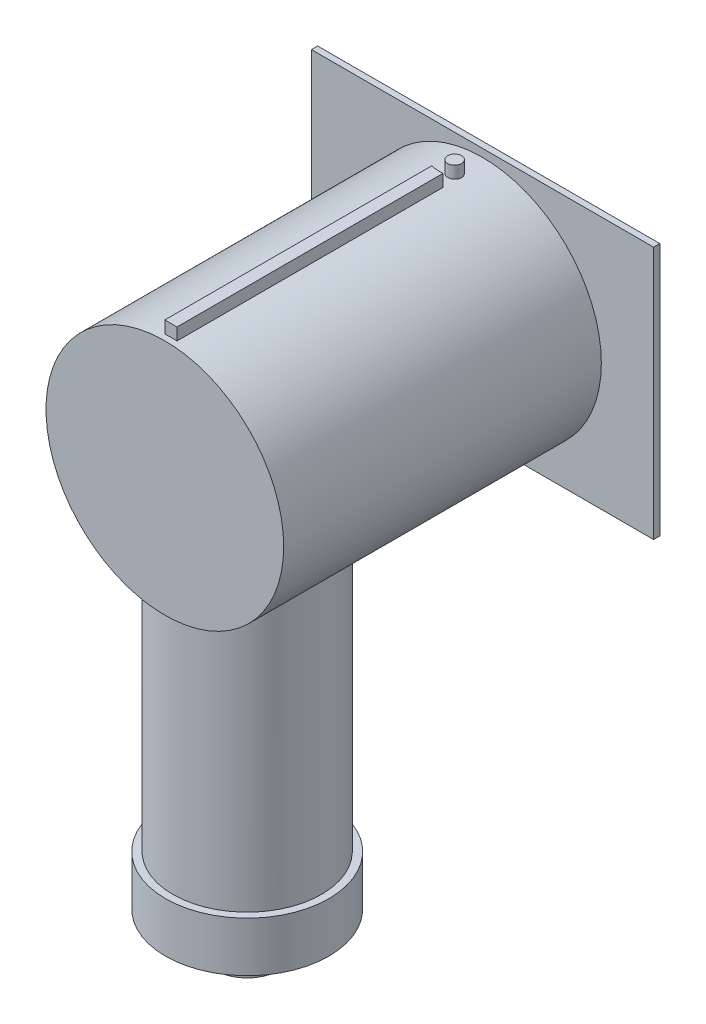
ISO-10303-21;
HEADER;
FILE_DESCRIPTION(('STEP AP214'),'2;1');
FILE_NAME('part.step','',(''),(''),'','','');
FILE_SCHEMA(('AUTOMOTIVE_DESIGN { 1 0 10303 214 1 1 1 1 }'));
ENDSEC;
DATA;
#1=APPLICATION_CONTEXT('core data for automotive mechanical design processes');
#2=APPLICATION_PROTOCOL_DEFINITION('international standard','automotive_design',2000,#1);
#3=PRODUCT_CONTEXT('',#1,'mechanical');
#4=PRODUCT('Part','Part','',(#3));
#5=PRODUCT_RELATED_PRODUCT_CATEGORY('part','',(#4));
#6=PRODUCT_DEFINITION_FORMATION('','',#4);
#7=PRODUCT_DEFINITION_CONTEXT('part definition',#1,'design');
#8=PRODUCT_DEFINITION('design','',#6,#7);
#9=PRODUCT_DEFINITION_SHAPE('','',#8);
#10=(LENGTH_UNIT() NAMED_UNIT(*) SI_UNIT(.MILLI.,.METRE.));
#11=(NAMED_UNIT(*) PLANE_ANGLE_UNIT() SI_UNIT($,.RADIAN.));
#12=(NAMED_UNIT(*) SI_UNIT($,.STERADIAN.) SOLID_ANGLE_UNIT());
#13=UNCERTAINTY_MEASURE_WITH_UNIT(LENGTH_MEASURE(1.E-05),#10,'distance_accuracy_value','');
#14=(GEOMETRIC_REPRESENTATION_CONTEXT(3) GLOBAL_UNCERTAINTY_ASSIGNED_CONTEXT((#13)) GLOBAL_UNIT_ASSIGNED_CONTEXT((#10,
#11,#12)) REPRESENTATION_CONTEXT('',''));
#15=CARTESIAN_POINT('',(0.,0.,0.));
#16=DIRECTION('',(0.,0.,1.));
#17=DIRECTION('',(1.,0.,0.));
#18=AXIS2_PLACEMENT_3D('',#15,#16,#17);
#19=CARTESIAN_POINT('',(0.,0.,6.5));
#20=DIRECTION('',(0.,0.,-1.));
#21=DIRECTION('',(-1.,0.,0.));
#22=AXIS2_PLACEMENT_3D('',#19,#20,#21);
#23=CYLINDRICAL_SURFACE('',#22,2.3845167259063);
#24=DIRECTION('',(0.,0.,-1.));
#25=VECTOR('',#24,1.);
#26=CARTESIAN_POINT('',(-0.122121934554715,2.38138746306171,6.5));
#27=LINE('',#26,#25);
#28=CARTESIAN_POINT('',(-0.122121934554715,2.38138746306171,1.01892619563497));
#29=VERTEX_POINT('',#28);
#30=CARTESIAN_POINT('',(-0.122121934554715,2.38138746306171,6.37896582971287));
#31=VERTEX_POINT('',#30);
#32=EDGE_CURVE('E169',#29,#31,#27,.F.);
#33=ORIENTED_EDGE('',*,*,#32,.F.);
#34=CARTESIAN_POINT('',(-0.122121934554715,2.38138746306171,1.01892619563497));
#35=CARTESIAN_POINT('',(-0.102085989813972,2.38241763743722,1.02432102156372));
#36=CARTESIAN_POINT('',(-0.0817986557812083,2.38320180110364,1.02884606236923));
#37=CARTESIAN_POINT('',(-0.0408908355822062,2.38425321733201,1.03609583819693));
#38=CARTESIAN_POINT('',(-0.0202703282168622,2.38452043687028,1.0388204581964));
#39=CARTESIAN_POINT('',(0.0206588553751885,2.38451302280561,1.04236698778209));
#40=CARTESIAN_POINT('',(0.04096389854405,2.38425062427631,1.04323092905572));
#41=CARTESIAN_POINT('',(0.0815835692787753,2.38320804786599,1.04321060789996));
#42=CARTESIAN_POINT('',(0.101898181072966,2.38242727571816,1.04232433671077));
#43=CARTESIAN_POINT('',(0.122121934554715,2.38138746306171,1.04057675696859));
#44=B_SPLINE_CURVE_WITH_KNOTS('',3,(#34,#35,#36,#37,#38,#39,#40,#41,#42,#43),.UNSPECIFIED.,.F.,
.F.,(4,2,2,2,4),(0.,0.0623114777401351,0.124626935962479,0.185519280055164,0.246481552334192),.UNSPECIFIED.);
#45=CARTESIAN_POINT('',(0.122121934554715,2.38138746306171,1.04057675696859));
#46=VERTEX_POINT('',#45);
#47=EDGE_CURVE('E54',#29,#46,#44,.T.);
#48=ORIENTED_EDGE('',*,*,#47,.T.);
#49=DIRECTION('',(0.,0.,-1.));
#50=VECTOR('',#49,1.);
#51=CARTESIAN_POINT('',(0.122121934554715,2.38138746306171,6.5));
#52=LINE('',#51,#50);
#53=CARTESIAN_POINT('',(0.122121934554715,2.38138746306171,6.37896582971287));
#54=VERTEX_POINT('',#53);
#55=EDGE_CURVE('E194',#46,#54,#52,.F.);
#56=ORIENTED_EDGE('',*,*,#55,.T.);
#57=CARTESIAN_POINT('',(0.,0.,6.37896582971287));
#58=DIRECTION('',(0.,0.,1.));
#59=DIRECTION('',(1.,0.,0.));
#60=AXIS2_PLACEMENT_3D('',#57,#58,#59);
#61=CIRCLE('',#60,2.3845167259063);
#62=EDGE_CURVE('E225',#54,#31,#61,.T.);
#63=ORIENTED_EDGE('',*,*,#62,.T.);
#64=EDGE_LOOP('',(#33,#48,#56,#63));
#65=FACE_BOUND('',#64,.T.);
#66=CARTESIAN_POINT('',(0.,0.,6.5));
#67=DIRECTION('',(0.,0.,1.));
#68=DIRECTION('',(1.,0.,0.));
#69=AXIS2_PLACEMENT_3D('',#66,#67,#68);
#70=CIRCLE('',#69,2.3845167259063);
#71=CARTESIAN_POINT('',(2.3845167259063,0.,6.5));
#72=VERTEX_POINT('',#71);
#73=EDGE_CURVE('E237',#72,#72,#70,.T.);
#74=ORIENTED_EDGE('',*,*,#73,.F.);
#75=EDGE_LOOP('',(#74));
#76=FACE_BOUND('',#75,.T.);
#77=CARTESIAN_POINT('',(0.,0.,0.125));
#78=DIRECTION('',(0.,0.,1.));
#79=DIRECTION('',(1.,0.,0.));
#80=AXIS2_PLACEMENT_3D('',#77,#78,#79);
#81=CIRCLE('',#80,2.3845167259063);
#82=CARTESIAN_POINT('',(2.3845167259063,0.,0.125));
#83=VERTEX_POINT('',#82);
#84=EDGE_CURVE('E191',#83,#83,#81,.T.);
#85=ORIENTED_EDGE('',*,*,#84,.T.);
#86=EDGE_LOOP('',(#85));
#87=FACE_BOUND('',#86,.T.);
#88=CARTESIAN_POINT('',(0.212826258076589,-2.375,3.32366384002746));
#89=CARTESIAN_POINT('',(0.142938540129505,-2.38126357883713,3.3108127370552));
#90=CARTESIAN_POINT('',(0.0718669584959559,-2.38449897489251,3.30292980364695));
#91=CARTESIAN_POINT('',(-0.0706808363945598,-2.38453432941735,3.29742804666196));
#92=CARTESIAN_POINT('',(-0.142157070307155,-2.3813339563625,3.29980975185246));
#93=CARTESIAN_POINT('',(-0.29173310890456,-2.36792771622794,3.31552862510206));
#94=CARTESIAN_POINT('',(-0.369633798479355,-2.35694872881265,3.33011047157984));
#95=CARTESIAN_POINT('',(-0.520996468308414,-2.3281828403061,3.37091415405692));
#96=CARTESIAN_POINT('',(-0.594455008004497,-2.31039073854542,3.39714488447334));
#97=CARTESIAN_POINT('',(-0.734754746865814,-2.26966183942903,3.45974506340821));
#98=CARTESIAN_POINT('',(-0.801632525621713,-2.2467561030199,3.49605360888655));
#99=CARTESIAN_POINT('',(-0.928241927778966,-2.19747773935296,3.57762797738249));
#100=CARTESIAN_POINT('',(-0.987970793997837,-2.1711037826544,3.62289723860735));
#101=CARTESIAN_POINT('',(-1.1057056341888,-2.11378177979883,3.72675447497885));
#102=CARTESIAN_POINT('',(-1.16281477613432,-2.08264845892151,3.78625620491107));
#103=CARTESIAN_POINT('',(-1.26668511685379,-2.02115591434425,3.91410488453446));
#104=CARTESIAN_POINT('',(-1.31344321477456,-1.99079692501346,3.98245447507999));
#105=CARTESIAN_POINT('',(-1.39050655401137,-1.93760893295867,4.11832175300606));
#106=CARTESIAN_POINT('',(-1.42212862836919,-1.91431303671533,4.18490597390821));
#107=CARTESIAN_POINT('',(-1.47555243578993,-1.87344678808757,4.32352704754425));
#108=CARTESIAN_POINT('',(-1.49737141860018,-1.85586639376502,4.39555405996258));
#109=CARTESIAN_POINT('',(-1.52755089724699,-1.83107457684479,4.53240893422933));
#110=CARTESIAN_POINT('',(-1.53744587876416,-1.8226984751376,4.59668211199222));
#111=CARTESIAN_POINT('',(-1.54872763653146,-1.81312510278807,4.72648459846253));
#112=CARTESIAN_POINT('',(-1.55012110064506,-1.81192218925191,4.7920128791002));
#113=CARTESIAN_POINT('',(-1.54431722377654,-1.81686983069717,4.92235509454555));
#114=CARTESIAN_POINT('',(-1.5371246278066,-1.82301632409522,4.98716940395297));
#115=CARTESIAN_POINT('',(-1.51461060160071,-1.84176090494204,5.11443087030132));
#116=CARTESIAN_POINT('',(-1.49927893238694,-1.85436711804145,5.17687493921446));
#117=CARTESIAN_POINT('',(-1.45580505990154,-1.8887870588679,5.31539393486605));
#118=CARTESIAN_POINT('',(-1.42526307794793,-1.91219804383863,5.39031320667404));
#119=CARTESIAN_POINT('',(-1.35342384637945,-1.96369914766551,5.53303154839159));
#120=CARTESIAN_POINT('',(-1.3121126112133,-1.99179533376141,5.60082119751833));
#121=CARTESIAN_POINT('',(-1.21904864052438,-2.05009822208556,5.72956917799522));
#122=CARTESIAN_POINT('',(-1.16714540035314,-2.08033069540126,5.79040671327927));
#123=CARTESIAN_POINT('',(-1.05400603181466,-2.13987858629751,5.90329129765955));
#124=CARTESIAN_POINT('',(-0.992764871304995,-2.16919349908252,5.95533357497605));
#125=CARTESIAN_POINT('',(-0.854145840434318,-2.22769942981627,6.05490232590052));
#126=CARTESIAN_POINT('',(-0.775722729788127,-2.25649039049784,6.10122573894695));
#127=CARTESIAN_POINT('',(-0.609934712264235,-2.3068016126893,6.1792983208587));
#128=CARTESIAN_POINT('',(-0.522600771359867,-2.32834600574492,6.21109599069618));
#129=CARTESIAN_POINT('',(-0.39653835981177,-2.35159894487115,6.24388561469618));
#130=CARTESIAN_POINT('',(-0.360277487164992,-2.35743246259105,6.2518886626363));
#131=CARTESIAN_POINT('',(-0.287034625119794,-2.36746617058872,6.265197972155));
#132=CARTESIAN_POINT('',(-0.250052570219086,-2.37166621177149,6.27050398757645));
#133=CARTESIAN_POINT('',(-0.142249967498407,-2.38132043286589,6.28182456577913));
#134=CARTESIAN_POINT('',(-0.0707957364349295,-2.38452726904377,6.28421536683819));
#135=CARTESIAN_POINT('',(0.0717746292865236,-2.38450608692443,6.27873386695721));
#136=CARTESIAN_POINT('',(0.142890151643126,-2.38126906652708,6.27084721367761));
#137=CARTESIAN_POINT('',(0.291883919485536,-2.36791327807447,6.24344670523125));
#138=CARTESIAN_POINT('',(0.369434446387407,-2.3569520100626,6.22255051067457));
#139=CARTESIAN_POINT('',(0.519140405782813,-2.32856981997102,6.16915671217843));
#140=CARTESIAN_POINT('',(0.591292727700522,-2.31114520748603,6.13665248074066));
#141=CARTESIAN_POINT('',(0.728185878805484,-2.27172031519383,6.06164050341451));
#142=CARTESIAN_POINT('',(0.792967097839708,-2.24974703721209,6.01919160365642));
#143=CARTESIAN_POINT('',(0.91464012887446,-2.20308999471252,5.92540603579568));
#144=CARTESIAN_POINT('',(0.971527626050002,-2.17840476090459,5.87406454107003));
#145=CARTESIAN_POINT('',(1.08214238525339,-2.12579729808576,5.75773851828276));
#146=CARTESIAN_POINT('',(1.13493097389745,-2.09780475020128,5.691891477224));
#147=CARTESIAN_POINT('',(1.22902316654179,-2.04410312964557,5.55158748711998));
#148=CARTESIAN_POINT('',(1.27033090569855,-2.01839323708728,5.4771336517746));
#149=CARTESIAN_POINT('',(1.33431089382563,-1.97654945849168,5.33381780137487));
#150=CARTESIAN_POINT('',(1.35894178612245,-1.95953370085548,5.26609263249386));
#151=CARTESIAN_POINT('',(1.39832206826948,-1.93163271582537,5.1266498971412));
#152=CARTESIAN_POINT('',(1.41308549643197,-1.92073878252302,5.05493816042664));
#153=CARTESIAN_POINT('',(1.43196495191351,-1.90671051516325,4.90890175633298));
#154=CARTESIAN_POINT('',(1.43601790519399,-1.90362215277295,4.83456421136378));
#155=CARTESIAN_POINT('',(1.43299270635499,-1.9058998874539,4.68623828572052));
#156=CARTESIAN_POINT('',(1.42591280737693,-1.9112673113249,4.61224996167));
#157=CARTESIAN_POINT('',(1.40222684703537,-1.92869497681388,4.47351747463281));
#158=CARTESIAN_POINT('',(1.38651607210959,-1.94012315552653,4.40853355051799));
#159=CARTESIAN_POINT('',(1.34698227272831,-1.96777485556509,4.28217525172459));
#160=CARTESIAN_POINT('',(1.32315595160279,-1.98400032527647,4.22080235580601));
#161=CARTESIAN_POINT('',(1.26465268118061,-2.02186318500433,4.0950330869427));
#162=CARTESIAN_POINT('',(1.22898828288742,-2.04392448099772,4.03122636583707));
#163=CARTESIAN_POINT('',(1.14911999803909,-2.08987293523622,3.90989476946634));
#164=CARTESIAN_POINT('',(1.10490834524453,-2.11376174198077,3.85237568227239));
#165=CARTESIAN_POINT('',(0.999783125442746,-2.16572988113784,3.73441708419353));
#166=CARTESIAN_POINT('',(0.937294103150628,-2.19377928149274,3.67535657377612));
#167=CARTESIAN_POINT('',(0.802250437963933,-2.24667844978581,3.5683116019412));
#168=CARTESIAN_POINT('',(0.729699536436778,-2.27152940043052,3.52032304116123));
#169=CARTESIAN_POINT('',(0.585099468941856,-2.31269068681766,3.44210433668849));
#170=CARTESIAN_POINT('',(0.51401909253147,-2.3296656140004,3.41044009086108));
#171=CARTESIAN_POINT('',(0.366718019670422,-2.35733579944474,3.3583680572613));
#172=CARTESIAN_POINT('',(0.290503372495732,-2.36803830852836,3.33794727387408));
#173=CARTESIAN_POINT('',(0.212826258076589,-2.375,3.32366384002746));
#174=B_SPLINE_CURVE_WITH_KNOTS('',3,(#88,#89,#90,#91,#92,#93,#94,#95,#96,#97,#98,#99,#100,#101,
#102,#103,#104,#105,#106,#107,#108,#109,#110,#111,#112,#113,#114,#115,#116,#117,#118,#119,#120,
#121,#122,#123,#124,#125,#126,#127,#128,#129,#130,#131,#132,#133,#134,#135,#136,#137,#138,#139,
#140,#141,#142,#143,#144,#145,#146,#147,#148,#149,#150,#151,#152,#153,#154,#155,#156,#157,#158,
#159,#160,#161,#162,#163,#164,#165,#166,#167,#168,#169,#170,#171,#172,#173),.UNSPECIFIED.,.T.,
.F.,(4,2,2,2,2,2,2,2,2,2,2,2,2,2,2,2,2,2,2,2,2,2,2,2,2,2,2,2,2,2,2,2,2,2,2,2,2,2,2,2,2,2,4),(0.,
0.21373875470751,0.427488519973362,0.666154356877764,0.905002739431717,1.14243799590935,
1.37996453299903,1.6433717644437,1.90685779809999,2.13790654785067,2.36854713114096,
2.56436942058586,2.76003764320804,2.95559778151406,3.15140452006714,3.40273355296663,
3.65439061594401,3.90990955795646,4.16556668726641,4.45055429204074,4.73458324979572,
4.84723619694586,4.95989942404223,5.17349438404236,5.38738794668449,5.62917900019421,
5.87110832328932,6.11164069573193,6.35230403311082,6.6179113895914,6.88342295563991,
7.10467356172465,7.32560872361576,7.54784210396428,7.77011035848695,7.97277449763617,
8.17552106071017,8.40375255743572,8.63219241377241,8.90227489685147,9.17225722149967,
9.41009389600236,9.64765508977021),.UNSPECIFIED.);
#175=CARTESIAN_POINT('',(0.212826258076589,-2.375,3.32366384002746));
#176=VERTEX_POINT('',#175);
#177=EDGE_CURVE('E183',#176,#176,#174,.T.);
#178=ORIENTED_EDGE('',*,*,#177,.T.);
#179=EDGE_LOOP('',(#178));
#180=FACE_BOUND('',#179,.T.);
#181=CARTESIAN_POINT('',(0.,2.3845167259063,0.545865245858107));
#182=CARTESIAN_POINT('',(-0.00776868139550286,2.38451667235779,0.545865588082946));
#183=CARTESIAN_POINT('',(-0.0155428289597243,2.38447835448068,0.546521407362929));
#184=CARTESIAN_POINT('',(-0.0308765387194732,2.3843291806601,0.54912823019523));
#185=CARTESIAN_POINT('',(-0.0384358391935083,2.384218239895,0.551080748296426));
#186=CARTESIAN_POINT('',(-0.0531155205078534,2.38393637306068,0.556224766996493));
#187=CARTESIAN_POINT('',(-0.0602361276603108,2.38376547823025,0.55941562245686));
#188=CARTESIAN_POINT('',(-0.073838775769793,2.3833829340544,0.566944713867192));
#189=CARTESIAN_POINT('',(-0.0803209642052641,2.38317129415485,0.571282683969732));
#190=CARTESIAN_POINT('',(-0.0924731615686663,2.382730745838,0.580989132644677));
#191=CARTESIAN_POINT('',(-0.0981422245555248,2.38250181777359,0.586358794712902));
#192=CARTESIAN_POINT('',(-0.108499166526239,2.38205266298088,0.597973786008611));
#193=CARTESIAN_POINT('',(-0.113187004864099,2.38183243661334,0.604219151493119));
#194=CARTESIAN_POINT('',(-0.121451249263488,2.38142537231397,0.617413504162506));
#195=CARTESIAN_POINT('',(-0.125026883751787,2.38123855759894,0.624362975397984));
#196=CARTESIAN_POINT('',(-0.130960280500322,2.38091963342288,0.638764871527132));
#197=CARTESIAN_POINT('',(-0.133318054385651,2.38078752343967,0.646217291619135));
#198=CARTESIAN_POINT('',(-0.136746213915248,2.38059309098579,0.661404547944237));
#199=CARTESIAN_POINT('',(-0.137818061594768,2.3805306892658,0.669139053127015));
#200=CARTESIAN_POINT('',(-0.138648455356697,2.38048247282634,0.684678435765667));
#201=CARTESIAN_POINT('',(-0.138407014593066,2.38049665733976,0.692483312515915));
#202=CARTESIAN_POINT('',(-0.136618899849148,2.3805999401825,0.707931933726632));
#203=CARTESIAN_POINT('',(-0.135073807002405,2.38068894776222,0.715575861887758));
#204=CARTESIAN_POINT('',(-0.130724699253515,2.38093170267453,0.730495676965043));
#205=CARTESIAN_POINT('',(-0.127920677653893,2.38108545035152,0.73777156192299));
#206=CARTESIAN_POINT('',(-0.121131509177827,2.38144046271979,0.751753840262182));
#207=CARTESIAN_POINT('',(-0.117145643676612,2.38164175630635,0.758459883948055));
#208=CARTESIAN_POINT('',(-0.108106453187618,2.38206914565049,0.77110829616551));
#209=CARTESIAN_POINT('',(-0.103053117900761,2.38229524164736,0.7770506573281));
#210=CARTESIAN_POINT('',(-0.0920135216657076,2.38274715800512,0.788012223238108));
#211=CARTESIAN_POINT('',(-0.0860258920354624,2.38297297746383,0.79303004970127));
#212=CARTESIAN_POINT('',(-0.0732924765975024,2.38339856931606,0.801989481302403));
#213=CARTESIAN_POINT('',(-0.0665466905572768,2.3835983417016,0.805931086110318));
#214=CARTESIAN_POINT('',(-0.0524876256698558,2.38394933987045,0.812626064199662));
#215=CARTESIAN_POINT('',(-0.0451743226538002,2.38410056358482,0.815379386842887));
#216=CARTESIAN_POINT('',(-0.0301881889623949,2.38433739410723,0.819618730746659));
#217=CARTESIAN_POINT('',(-0.0225153619119499,2.38442300157671,0.821104764781757));
#218=CARTESIAN_POINT('',(-0.00703994457085498,2.38451886728,0.822765644052586));
#219=CARTESIAN_POINT('',(0.000762440521349029,2.38452923503945,0.822942395205421));
#220=CARTESIAN_POINT('',(0.016286007999242,2.38447374408636,0.821984668954591));
#221=CARTESIAN_POINT('',(0.0240071907485729,2.38440788571533,0.820850197425393));
#222=CARTESIAN_POINT('',(0.0391438192902321,2.38420742844233,0.817303807148036));
#223=CARTESIAN_POINT('',(0.0465594702557405,2.38407287651077,0.814892761237871));
#224=CARTESIAN_POINT('',(0.0608808601481068,2.38375017388913,0.808862548792054));
#225=CARTESIAN_POINT('',(0.0677865951143272,2.38356202278279,0.805243372873775));
#226=CARTESIAN_POINT('',(0.0809008614043833,2.38315299963983,0.796894773108784));
#227=CARTESIAN_POINT('',(0.087108580059016,2.38293209014365,0.792164074555779));
#228=CARTESIAN_POINT('',(0.098642422177852,2.38248254341299,0.781728574743935));
#229=CARTESIAN_POINT('',(0.103968538117524,2.38225390611258,0.776023765171845));
#230=CARTESIAN_POINT('',(0.113594427139734,2.38181435755232,0.763793768084417));
#231=CARTESIAN_POINT('',(0.117892965022776,2.38160346782117,0.757267607499176));
#232=CARTESIAN_POINT('',(0.125333231893234,2.38122353740493,0.743585062451792));
#233=CARTESIAN_POINT('',(0.128474967218167,2.38105449649057,0.736428681442563));
#234=CARTESIAN_POINT('',(0.133510301984257,2.38077748113883,0.721693375155227));
#235=CARTESIAN_POINT('',(0.135404682663039,2.38066946848455,0.714114717588138));
#236=CARTESIAN_POINT('',(0.137894086485561,2.38052658370535,0.698746259353496));
#237=CARTESIAN_POINT('',(0.138489120417238,2.3804917109732,0.690956460439506));
#238=CARTESIAN_POINT('',(0.138362837648005,2.38049905333521,0.675399129450009));
#239=CARTESIAN_POINT('',(0.13764346326863,2.38054115468364,0.667631581479699));
#240=CARTESIAN_POINT('',(0.134912806806628,2.38069745981921,0.652327752941764));
#241=CARTESIAN_POINT('',(0.132901522333194,2.38081166373978,0.644791472802149));
#242=CARTESIAN_POINT('',(0.127644562315071,2.38109927644821,0.630163775474394));
#243=CARTESIAN_POINT('',(0.124398887945501,2.38127268517971,0.62307235786276));
#244=CARTESIAN_POINT('',(0.116765568123587,2.38165916083067,0.609534889920875));
#245=CARTESIAN_POINT('',(0.112377954327062,2.38187222665074,0.603088821707687));
#246=CARTESIAN_POINT('',(0.102578186078559,2.3823143694084,0.591015225349276));
#247=CARTESIAN_POINT('',(0.0971646418219102,2.38254346779629,0.585388826093804));
#248=CARTESIAN_POINT('',(0.0854682805919308,2.38299168369755,0.575122808140042));
#249=CARTESIAN_POINT('',(0.0791852508222559,2.38321079875011,0.570483431711391));
#250=CARTESIAN_POINT('',(0.0659219689952055,2.38361455563976,0.562320216614448));
#251=CARTESIAN_POINT('',(0.0589409370138782,2.38379915823792,0.55879764456891));
#252=CARTESIAN_POINT('',(0.0444905908663096,2.38411254229397,0.55297887084892));
#253=CARTESIAN_POINT('',(0.0370218620743664,2.38424138930681,0.550681228214873));
#254=CARTESIAN_POINT('',(0.0245893059598253,2.38439485898689,0.547976808890908));
#255=CARTESIAN_POINT('',(0.0197059059877991,2.38444035684327,0.547185991705346));
#256=CARTESIAN_POINT('',(0.00988240807349675,2.38450130731865,0.546130101639246));
#257=CARTESIAN_POINT('',(0.00494231019793313,2.384516759973,0.545865028140166));
#258=CARTESIAN_POINT('',(0.,2.3845167259063,0.545865245858107));
#259=B_SPLINE_CURVE_WITH_KNOTS('',3,(#181,#182,#183,#184,#185,#186,#187,#188,#189,#190,#191,
#192,#193,#194,#195,#196,#197,#198,#199,#200,#201,#202,#203,#204,#205,#206,#207,#208,#209,#210,
#211,#212,#213,#214,#215,#216,#217,#218,#219,#220,#221,#222,#223,#224,#225,#226,#227,#228,#229,
#230,#231,#232,#233,#234,#235,#236,#237,#238,#239,#240,#241,#242,#243,#244,#245,#246,#247,#248,
#249,#250,#251,#252,#253,#254,#255,#256,#257,#258),.UNSPECIFIED.,.T.,.F.,(4,2,2,2,2,2,2,2,2,2,2,
2,2,2,2,2,2,2,2,2,2,2,2,2,2,2,2,2,2,2,2,2,2,2,2,2,2,2,4),(0.,0.0232880022382502,
0.0466032528978067,0.0699063732460268,0.0932040977487335,0.116528709332061,0.139854286916932,
0.163196010334609,0.186537510939653,0.209852448173138,0.233167151883517,0.256453618951657,
0.279740209904798,0.303040989498862,0.326341993911921,0.349677458958796,0.373012931162194,
0.39634939769992,0.419685628998097,0.442987883162981,0.466290032930793,0.489576270749546,
0.512862689418964,0.536175944687313,0.559489398925411,0.582830737734767,0.606171948667228,
0.629498526695293,0.65282491105171,0.676116853521995,0.699408839096448,0.722700802497397,
0.745992120288248,0.769315218807806,0.792644035509327,0.815999216696296,0.839326862787184,
0.854142332814149,0.868957785410548),.UNSPECIFIED.);
#260=CARTESIAN_POINT('',(0.,2.3845167259063,0.545865245858107));
#261=VERTEX_POINT('',#260);
#262=EDGE_CURVE('E11',#261,#261,#259,.T.);
#263=ORIENTED_EDGE('',*,*,#262,.F.);
#264=EDGE_LOOP('',(#263));
#265=FACE_BOUND('',#264,.T.);
#266=ADVANCED_FACE('F41',(#65,#76,#87,#180,#265),#23,.T.);
#267=CARTESIAN_POINT('',(-3.43317012939096,-2.54099762866107,0.125));
#268=DIRECTION('',(1.,0.,0.));
#269=DIRECTION('',(0.,0.,-1.));
#270=AXIS2_PLACEMENT_3D('',#267,#268,#269);
#271=PLANE('',#270);
#272=DIRECTION('',(0.,-1.,0.));
#273=VECTOR('',#272,1.);
#274=CARTESIAN_POINT('',(-3.43317012939096,-2.54099762866107,0.));
#275=LINE('',#274,#273);
#276=CARTESIAN_POINT('',(-3.43317012939096,2.54099762866107,0.));
#277=VERTEX_POINT('',#276);
#278=CARTESIAN_POINT('',(-3.43317012939096,-2.54099762866107,0.));
#279=VERTEX_POINT('',#278);
#280=EDGE_CURVE('E240',#277,#279,#275,.T.);
#281=ORIENTED_EDGE('',*,*,#280,.T.);
#282=DIRECTION('',(0.,0.,-1.));
#283=VECTOR('',#282,1.);
#284=CARTESIAN_POINT('',(-3.43317012939096,-2.54099762866107,0.125));
#285=LINE('',#284,#283);
#286=CARTESIAN_POINT('',(-3.43317012939096,-2.54099762866107,0.125));
#287=VERTEX_POINT('',#286);
#288=EDGE_CURVE('E192',#287,#279,#285,.T.);
#289=ORIENTED_EDGE('',*,*,#288,.F.);
#290=DIRECTION('',(0.,-1.,0.));
#291=VECTOR('',#290,1.);
#292=CARTESIAN_POINT('',(-3.43317012939096,-2.54099762866107,0.125));
#293=LINE('',#292,#291);
#294=CARTESIAN_POINT('',(-3.43317012939096,2.54099762866107,0.125));
#295=VERTEX_POINT('',#294);
#296=EDGE_CURVE('E243',#295,#287,#293,.T.);
#297=ORIENTED_EDGE('',*,*,#296,.F.);
#298=DIRECTION('',(0.,0.,-1.));
#299=VECTOR('',#298,1.);
#300=CARTESIAN_POINT('',(-3.43317012939096,2.54099762866107,0.125));
#301=LINE('',#300,#299);
#302=EDGE_CURVE('E249',#295,#277,#301,.T.);
#303=ORIENTED_EDGE('',*,*,#302,.T.);
#304=EDGE_LOOP('',(#281,#289,#297,#303));
#305=FACE_BOUND('',#304,.T.);
#306=ADVANCED_FACE('F43',(#305),#271,.F.);
#307=CARTESIAN_POINT('',(3.43317012939096,-2.54099762866107,0.125));
#308=DIRECTION('',(0.,1.,0.));
#309=DIRECTION('',(0.,0.,1.));
#310=AXIS2_PLACEMENT_3D('',#307,#308,#309);
#311=PLANE('',#310);
#312=DIRECTION('',(1.,0.,0.));
#313=VECTOR('',#312,1.);
#314=CARTESIAN_POINT('',(3.43317012939096,-2.54099762866107,0.));
#315=LINE('',#314,#313);
#316=CARTESIAN_POINT('',(3.43317012939096,-2.54099762866107,0.));
#317=VERTEX_POINT('',#316);
#318=EDGE_CURVE('E252',#279,#317,#315,.T.);
#319=ORIENTED_EDGE('',*,*,#318,.T.);
#320=DIRECTION('',(0.,0.,-1.));
#321=VECTOR('',#320,1.);
#322=CARTESIAN_POINT('',(3.43317012939096,-2.54099762866107,0.125));
#323=LINE('',#322,#321);
#324=CARTESIAN_POINT('',(3.43317012939096,-2.54099762866107,0.125));
#325=VERTEX_POINT('',#324);
#326=EDGE_CURVE('E259',#325,#317,#323,.T.);
#327=ORIENTED_EDGE('',*,*,#326,.F.);
#328=DIRECTION('',(1.,0.,0.));
#329=VECTOR('',#328,1.);
#330=CARTESIAN_POINT('',(3.43317012939096,-2.54099762866107,0.125));
#331=LINE('',#330,#329);
#332=EDGE_CURVE('E99',#287,#325,#331,.T.);
#333=ORIENTED_EDGE('',*,*,#332,.F.);
#334=ORIENTED_EDGE('',*,*,#288,.T.);
#335=EDGE_LOOP('',(#319,#327,#333,#334));
#336=FACE_BOUND('',#335,.T.);
#337=ADVANCED_FACE('F265',(#336),#311,.F.);
#338=CARTESIAN_POINT('',(3.43317012939096,-2.54099762866107,0.125));
#339=DIRECTION('',(-1.,0.,0.));
#340=DIRECTION('',(0.,0.,1.));
#341=AXIS2_PLACEMENT_3D('',#338,#339,#340);
#342=PLANE('',#341);
#343=DIRECTION('',(0.,1.,0.));
#344=VECTOR('',#343,1.);
#345=CARTESIAN_POINT('',(3.43317012939096,-2.54099762866107,0.));
#346=LINE('',#345,#344);
#347=CARTESIAN_POINT('',(3.43317012939096,2.54099762866107,0.));
#348=VERTEX_POINT('',#347);
#349=EDGE_CURVE('E254',#317,#348,#346,.T.);
#350=ORIENTED_EDGE('',*,*,#349,.T.);
#351=DIRECTION('',(0.,0.,-1.));
#352=VECTOR('',#351,1.);
#353=CARTESIAN_POINT('',(3.43317012939096,2.54099762866107,0.125));
#354=LINE('',#353,#352);
#355=CARTESIAN_POINT('',(3.43317012939096,2.54099762866107,0.125));
#356=VERTEX_POINT('',#355);
#357=EDGE_CURVE('E258',#356,#348,#354,.T.);
#358=ORIENTED_EDGE('',*,*,#357,.F.);
#359=DIRECTION('',(0.,1.,0.));
#360=VECTOR('',#359,1.);
#361=CARTESIAN_POINT('',(3.43317012939096,-2.54099762866107,0.125));
#362=LINE('',#361,#360);
#363=EDGE_CURVE('E246',#325,#356,#362,.T.);
#364=ORIENTED_EDGE('',*,*,#363,.F.);
#365=ORIENTED_EDGE('',*,*,#326,.T.);
#366=EDGE_LOOP('',(#350,#358,#364,#365));
#367=FACE_BOUND('',#366,.T.);
#368=ADVANCED_FACE('F272',(#367),#342,.F.);
#369=CARTESIAN_POINT('',(3.43317012939096,2.54099762866107,0.125));
#370=DIRECTION('',(0.,-1.,0.));
#371=DIRECTION('',(0.,0.,-1.));
#372=AXIS2_PLACEMENT_3D('',#369,#370,#371);
#373=PLANE('',#372);
#374=DIRECTION('',(-1.,0.,0.));
#375=VECTOR('',#374,1.);
#376=CARTESIAN_POINT('',(3.43317012939096,2.54099762866107,0.));
#377=LINE('',#376,#375);
#378=EDGE_CURVE('E91',#348,#277,#377,.T.);
#379=ORIENTED_EDGE('',*,*,#378,.T.);
#380=ORIENTED_EDGE('',*,*,#302,.F.);
#381=DIRECTION('',(-1.,0.,0.));
#382=VECTOR('',#381,1.);
#383=CARTESIAN_POINT('',(3.43317012939096,2.54099762866107,0.125));
#384=LINE('',#383,#382);
#385=EDGE_CURVE('E70',#356,#295,#384,.T.);
#386=ORIENTED_EDGE('',*,*,#385,.F.);
#387=ORIENTED_EDGE('',*,*,#357,.T.);
#388=EDGE_LOOP('',(#379,#380,#386,#387));
#389=FACE_BOUND('',#388,.T.);
#390=ADVANCED_FACE('F273',(#389),#373,.F.);
#391=CARTESIAN_POINT('',(0.,0.,0.125));
#392=DIRECTION('',(0.,0.,1.));
#393=DIRECTION('',(1.,0.,0.));
#394=AXIS2_PLACEMENT_3D('',#391,#392,#393);
#395=PLANE('',#394);
#396=ORIENTED_EDGE('',*,*,#84,.F.);
#397=EDGE_LOOP('',(#396));
#398=FACE_BOUND('',#397,.T.);
#399=ORIENTED_EDGE('',*,*,#296,.T.);
#400=ORIENTED_EDGE('',*,*,#332,.T.);
#401=ORIENTED_EDGE('',*,*,#363,.T.);
#402=ORIENTED_EDGE('',*,*,#385,.T.);
#403=EDGE_LOOP('',(#399,#400,#401,#402));
#404=FACE_BOUND('',#403,.T.);
#405=ADVANCED_FACE('F178',(#398,#404),#395,.T.);
#406=CARTESIAN_POINT('',(0.,0.,0.));
#407=DIRECTION('',(0.,0.,1.));
#408=DIRECTION('',(1.,0.,0.));
#409=AXIS2_PLACEMENT_3D('',#406,#407,#408);
#410=PLANE('',#409);
#411=ORIENTED_EDGE('',*,*,#280,.F.);
#412=ORIENTED_EDGE('',*,*,#378,.F.);
#413=ORIENTED_EDGE('',*,*,#349,.F.);
#414=ORIENTED_EDGE('',*,*,#318,.F.);
#415=EDGE_LOOP('',(#411,#412,#413,#414));
#416=FACE_BOUND('',#415,.T.);
#417=ADVANCED_FACE('F270',(#416),#410,.F.);
#418=CARTESIAN_POINT('',(0.,0.,6.5));
#419=DIRECTION('',(0.,0.,1.));
#420=DIRECTION('',(1.,0.,0.));
#421=AXIS2_PLACEMENT_3D('',#418,#419,#420);
#422=PLANE('',#421);
#423=ORIENTED_EDGE('',*,*,#73,.T.);
#424=EDGE_LOOP('',(#423));
#425=FACE_BOUND('',#424,.T.);
#426=ADVANCED_FACE('F176',(#425),#422,.T.);
#427=CARTESIAN_POINT('',(-0.0569401402237268,-7.375,4.79082477171833));
#428=DIRECTION('',(0.,1.,0.));
#429=DIRECTION('',(0.,0.,1.));
#430=AXIS2_PLACEMENT_3D('',#427,#428,#429);
#431=CYLINDRICAL_SURFACE('',#430,1.4917557136247);
#432=CARTESIAN_POINT('',(-0.0569401402237268,-7.375,4.79082477171833));
#433=DIRECTION('',(0.,1.,0.));
#434=DIRECTION('',(0.,0.,1.));
#435=AXIS2_PLACEMENT_3D('',#432,#433,#434);
#436=CIRCLE('',#435,1.4917557136247);
#437=CARTESIAN_POINT('',(-0.0569401402237268,-7.375,6.28258048534303));
#438=VERTEX_POINT('',#437);
#439=EDGE_CURVE('E231',#438,#438,#436,.T.);
#440=ORIENTED_EDGE('',*,*,#439,.T.);
#441=EDGE_LOOP('',(#440));
#442=FACE_BOUND('',#441,.T.);
#443=ORIENTED_EDGE('',*,*,#177,.F.);
#444=EDGE_LOOP('',(#443));
#445=FACE_BOUND('',#444,.T.);
#446=ADVANCED_FACE('F195',(#442,#445),#431,.T.);
#447=CARTESIAN_POINT('',(-0.0569401402237268,-8.375,4.79082477171833));
#448=DIRECTION('',(0.,1.,0.));
#449=DIRECTION('',(0.,0.,1.));
#450=AXIS2_PLACEMENT_3D('',#447,#448,#449);
#451=CYLINDRICAL_SURFACE('',#450,1.63904252418718);
#452=CARTESIAN_POINT('',(-0.0569401402237268,-8.375,4.79082477171833));
#453=DIRECTION('',(0.,-1.,0.));
#454=DIRECTION('',(0.,0.,-1.));
#455=AXIS2_PLACEMENT_3D('',#452,#453,#454);
#456=CIRCLE('',#455,1.63904252418718);
#457=CARTESIAN_POINT('',(-0.0569401402237268,-8.375,3.15178224753115));
#458=VERTEX_POINT('',#457);
#459=EDGE_CURVE('E228',#458,#458,#456,.T.);
#460=ORIENTED_EDGE('',*,*,#459,.F.);
#461=EDGE_LOOP('',(#460));
#462=FACE_BOUND('',#461,.T.);
#463=CARTESIAN_POINT('',(-0.0569401402237268,-7.375,4.79082477171833));
#464=DIRECTION('',(0.,-1.,0.));
#465=DIRECTION('',(0.,0.,-1.));
#466=AXIS2_PLACEMENT_3D('',#463,#464,#465);
#467=CIRCLE('',#466,1.63904252418718);
#468=CARTESIAN_POINT('',(-0.0569401402237268,-7.375,3.15178224753115));
#469=VERTEX_POINT('',#468);
#470=EDGE_CURVE('E232',#469,#469,#467,.T.);
#471=ORIENTED_EDGE('',*,*,#470,.T.);
#472=EDGE_LOOP('',(#471));
#473=FACE_BOUND('',#472,.T.);
#474=ADVANCED_FACE('F199',(#462,#473),#451,.T.);
#475=CARTESIAN_POINT('',(-0.0569401402237268,-8.375,4.79082477171833));
#476=DIRECTION('',(0.,-1.,0.));
#477=DIRECTION('',(0.,0.,-1.));
#478=AXIS2_PLACEMENT_3D('',#475,#476,#477);
#479=PLANE('',#478);
#480=CARTESIAN_POINT('',(-0.0569401402237268,-8.375,4.79082477171833));
#481=DIRECTION('',(0.,-1.,0.));
#482=DIRECTION('',(0.,0.,-1.));
#483=AXIS2_PLACEMENT_3D('',#480,#481,#482);
#484=CIRCLE('',#483,0.633885062852216);
#485=CARTESIAN_POINT('',(-0.0569401402237268,-8.375,4.15693970886611));
#486=VERTEX_POINT('',#485);
#487=EDGE_CURVE('E190',#486,#486,#484,.T.);
#488=ORIENTED_EDGE('',*,*,#487,.F.);
#489=EDGE_LOOP('',(#488));
#490=FACE_BOUND('',#489,.T.);
#491=ORIENTED_EDGE('',*,*,#459,.T.);
#492=EDGE_LOOP('',(#491));
#493=FACE_BOUND('',#492,.T.);
#494=ADVANCED_FACE('F203',(#490,#493),#479,.T.);
#495=CARTESIAN_POINT('',(-0.0569401402237268,-7.375,4.79082477171833));
#496=DIRECTION('',(0.,-1.,0.));
#497=DIRECTION('',(0.,0.,-1.));
#498=AXIS2_PLACEMENT_3D('',#495,#496,#497);
#499=PLANE('',#498);
#500=ORIENTED_EDGE('',*,*,#439,.F.);
#501=EDGE_LOOP('',(#500));
#502=FACE_BOUND('',#501,.T.);
#503=ORIENTED_EDGE('',*,*,#470,.F.);
#504=EDGE_LOOP('',(#503));
#505=FACE_BOUND('',#504,.T.);
#506=ADVANCED_FACE('F205',(#502,#505),#499,.F.);
#507=CARTESIAN_POINT('',(-0.0569401402237268,-9.125,4.79082477171833));
#508=DIRECTION('',(0.,1.,0.));
#509=DIRECTION('',(0.,0.,1.));
#510=AXIS2_PLACEMENT_3D('',#507,#508,#509);
#511=CYLINDRICAL_SURFACE('',#510,0.633885062852216);
#512=CARTESIAN_POINT('',(-0.0569401402237268,-9.125,4.79082477171833));
#513=DIRECTION('',(0.,-1.,0.));
#514=DIRECTION('',(0.,0.,-1.));
#515=AXIS2_PLACEMENT_3D('',#512,#513,#514);
#516=CIRCLE('',#515,0.633885062852216);
#517=CARTESIAN_POINT('',(-0.0569401402237268,-9.125,4.15693970886611));
#518=VERTEX_POINT('',#517);
#519=EDGE_CURVE('E131',#518,#518,#516,.T.);
#520=ORIENTED_EDGE('',*,*,#519,.F.);
#521=EDGE_LOOP('',(#520));
#522=FACE_BOUND('',#521,.T.);
#523=ORIENTED_EDGE('',*,*,#487,.T.);
#524=EDGE_LOOP('',(#523));
#525=FACE_BOUND('',#524,.T.);
#526=ADVANCED_FACE('F208',(#522,#525),#511,.T.);
#527=CARTESIAN_POINT('',(-0.0569401402237268,-9.125,4.79082477171833));
#528=DIRECTION('',(0.,-1.,0.));
#529=DIRECTION('',(0.,0.,-1.));
#530=AXIS2_PLACEMENT_3D('',#527,#528,#529);
#531=PLANE('',#530);
#532=ORIENTED_EDGE('',*,*,#519,.T.);
#533=EDGE_LOOP('',(#532));
#534=FACE_BOUND('',#533,.T.);
#535=ADVANCED_FACE('F161',(#534),#531,.T.);
#536=CARTESIAN_POINT('',(-0.122121934554715,2.625,1.01892619563497));
#537=CARTESIAN_POINT('',(-0.00188970786467393,2.625,1.05123582379929));
#538=CARTESIAN_POINT('',(0.122121934554715,2.625,1.04057675696859));
#539=B_SPLINE_CURVE_WITH_KNOTS('',2,(#536,#537,#538),.UNSPECIFIED.,.F.,.F.,(3,3),(0.,1.),.UNSPECIFIED.);
#540=DIRECTION('',(0.,-1.,0.));
#541=VECTOR('',#540,1.);
#542=SURFACE_OF_LINEAR_EXTRUSION('',#539,#541);
#543=ORIENTED_EDGE('',*,*,#47,.F.);
#544=DIRECTION('',(0.,-1.,0.));
#545=VECTOR('',#544,1.);
#546=CARTESIAN_POINT('',(-0.122121934554715,2.625,1.01892619563497));
#547=LINE('',#546,#545);
#548=CARTESIAN_POINT('',(-0.122121934554715,2.625,1.01892619563497));
#549=VERTEX_POINT('',#548);
#550=EDGE_CURVE('E121',#549,#29,#547,.T.);
#551=ORIENTED_EDGE('',*,*,#550,.F.);
#552=CARTESIAN_POINT('',(0.122121934554715,2.625,1.04057675696859));
#553=VERTEX_POINT('',#552);
#554=EDGE_CURVE('E126',#549,#553,#539,.T.);
#555=ORIENTED_EDGE('',*,*,#554,.T.);
#556=DIRECTION('',(0.,-1.,0.));
#557=VECTOR('',#556,1.);
#558=CARTESIAN_POINT('',(0.122121934554715,2.625,1.04057675696859));
#559=LINE('',#558,#557);
#560=EDGE_CURVE('E311',#553,#46,#559,.T.);
#561=ORIENTED_EDGE('',*,*,#560,.T.);
#562=EDGE_LOOP('',(#543,#551,#555,#561));
#563=FACE_BOUND('',#562,.T.);
#564=ADVANCED_FACE('F123',(#563),#542,.T.);
#565=CARTESIAN_POINT('',(-0.122121934554715,2.625,0.));
#566=DIRECTION('',(1.,0.,0.));
#567=DIRECTION('',(0.,0.,-1.));
#568=AXIS2_PLACEMENT_3D('',#565,#566,#567);
#569=PLANE('',#568);
#570=ORIENTED_EDGE('',*,*,#550,.T.);
#571=ORIENTED_EDGE('',*,*,#32,.T.);
#572=DIRECTION('',(0.,-1.,0.));
#573=VECTOR('',#572,1.);
#574=CARTESIAN_POINT('',(-0.122121934554715,2.625,6.37896582971287));
#575=LINE('',#574,#573);
#576=CARTESIAN_POINT('',(-0.122121934554715,2.625,6.37896582971287));
#577=VERTEX_POINT('',#576);
#578=EDGE_CURVE('E132',#577,#31,#575,.T.);
#579=ORIENTED_EDGE('',*,*,#578,.F.);
#580=DIRECTION('',(0.,0.,1.));
#581=VECTOR('',#580,1.);
#582=CARTESIAN_POINT('',(-0.122121934554715,2.625,0.));
#583=LINE('',#582,#581);
#584=EDGE_CURVE('E135',#549,#577,#583,.T.);
#585=ORIENTED_EDGE('',*,*,#584,.F.);
#586=EDGE_LOOP('',(#570,#571,#579,#585));
#587=FACE_BOUND('',#586,.T.);
#588=ADVANCED_FACE('F136',(#587),#569,.F.);
#589=CARTESIAN_POINT('',(0.122121934554715,2.625,0.));
#590=DIRECTION('',(1.,0.,0.));
#591=DIRECTION('',(0.,0.,-1.));
#592=AXIS2_PLACEMENT_3D('',#589,#590,#591);
#593=PLANE('',#592);
#594=ORIENTED_EDGE('',*,*,#55,.F.);
#595=ORIENTED_EDGE('',*,*,#560,.F.);
#596=DIRECTION('',(0.,0.,1.));
#597=VECTOR('',#596,1.);
#598=CARTESIAN_POINT('',(0.122121934554715,2.625,0.));
#599=LINE('',#598,#597);
#600=CARTESIAN_POINT('',(0.122121934554715,2.625,6.37896582971287));
#601=VERTEX_POINT('',#600);
#602=EDGE_CURVE('E144',#553,#601,#599,.T.);
#603=ORIENTED_EDGE('',*,*,#602,.T.);
#604=DIRECTION('',(0.,-1.,0.));
#605=VECTOR('',#604,1.);
#606=CARTESIAN_POINT('',(0.122121934554715,2.625,6.37896582971287));
#607=LINE('',#606,#605);
#608=EDGE_CURVE('E61',#601,#54,#607,.T.);
#609=ORIENTED_EDGE('',*,*,#608,.T.);
#610=EDGE_LOOP('',(#594,#595,#603,#609));
#611=FACE_BOUND('',#610,.T.);
#612=ADVANCED_FACE('F303',(#611),#593,.T.);
#613=CARTESIAN_POINT('',(0.,2.625,6.37896582971287));
#614=DIRECTION('',(0.,0.,1.));
#615=DIRECTION('',(1.,0.,0.));
#616=AXIS2_PLACEMENT_3D('',#613,#614,#615);
#617=PLANE('',#616);
#618=ORIENTED_EDGE('',*,*,#62,.F.);
#619=ORIENTED_EDGE('',*,*,#608,.F.);
#620=DIRECTION('',(-1.,0.,0.));
#621=VECTOR('',#620,1.);
#622=CARTESIAN_POINT('',(0.,2.625,6.37896582971287));
#623=LINE('',#622,#621);
#624=EDGE_CURVE('E141',#601,#577,#623,.T.);
#625=ORIENTED_EDGE('',*,*,#624,.T.);
#626=ORIENTED_EDGE('',*,*,#578,.T.);
#627=EDGE_LOOP('',(#618,#619,#625,#626));
#628=FACE_BOUND('',#627,.T.);
#629=ADVANCED_FACE('F298',(#628),#617,.T.);
#630=CARTESIAN_POINT('',(0.,2.625,0.));
#631=DIRECTION('',(0.,1.,0.));
#632=DIRECTION('',(0.,0.,1.));
#633=AXIS2_PLACEMENT_3D('',#630,#631,#632);
#634=PLANE('',#633);
#635=ORIENTED_EDGE('',*,*,#554,.F.);
#636=ORIENTED_EDGE('',*,*,#584,.T.);
#637=ORIENTED_EDGE('',*,*,#624,.F.);
#638=ORIENTED_EDGE('',*,*,#602,.F.);
#639=EDGE_LOOP('',(#635,#636,#637,#638));
#640=FACE_BOUND('',#639,.T.);
#641=ADVANCED_FACE('F143',(#640),#634,.T.);
#642=CARTESIAN_POINT('',(0.,2.625,0.684295739022289));
#643=DIRECTION('',(0.,-1.,0.));
#644=DIRECTION('',(0.,0.,-1.));
#645=AXIS2_PLACEMENT_3D('',#642,#643,#644);
#646=CYLINDRICAL_SURFACE('',#645,0.138430493164183);
#647=CARTESIAN_POINT('',(0.,2.625,0.684295739022289));
#648=DIRECTION('',(0.,1.,0.));
#649=DIRECTION('',(0.,0.,1.));
#650=AXIS2_PLACEMENT_3D('',#647,#648,#649);
#651=CIRCLE('',#650,0.138430493164183);
#652=CARTESIAN_POINT('',(0.,2.625,0.822726232186472));
#653=VERTEX_POINT('',#652);
#654=EDGE_CURVE('E145',#653,#653,#651,.T.);
#655=ORIENTED_EDGE('',*,*,#654,.F.);
#656=EDGE_LOOP('',(#655));
#657=FACE_BOUND('',#656,.T.);
#658=ORIENTED_EDGE('',*,*,#262,.T.);
#659=EDGE_LOOP('',(#658));
#660=FACE_BOUND('',#659,.T.);
#661=ADVANCED_FACE('F288',(#657,#660),#646,.T.);
#662=CARTESIAN_POINT('',(0.,2.625,0.684295739022289));
#663=DIRECTION('',(0.,1.,0.));
#664=DIRECTION('',(0.,0.,1.));
#665=AXIS2_PLACEMENT_3D('',#662,#663,#664);
#666=PLANE('',#665);
#667=ORIENTED_EDGE('',*,*,#654,.T.);
#668=EDGE_LOOP('',(#667));
#669=FACE_BOUND('',#668,.T.);
#670=ADVANCED_FACE('F290',(#669),#666,.T.);
#671=CLOSED_SHELL('',(#266,#306,#337,#368,#390,#405,#417,#426,#446,#474,#494,#506,#526,#535,
#564,#588,#612,#629,#641,#661,#670));
#672=MANIFOLD_SOLID_BREP('B2',#671);
#673=ADVANCED_BREP_SHAPE_REPRESENTATION('',(#18,#672),#14);
#674=SHAPE_DEFINITION_REPRESENTATION(#9,#673);
ENDSEC;
END-ISO-10303-21;
